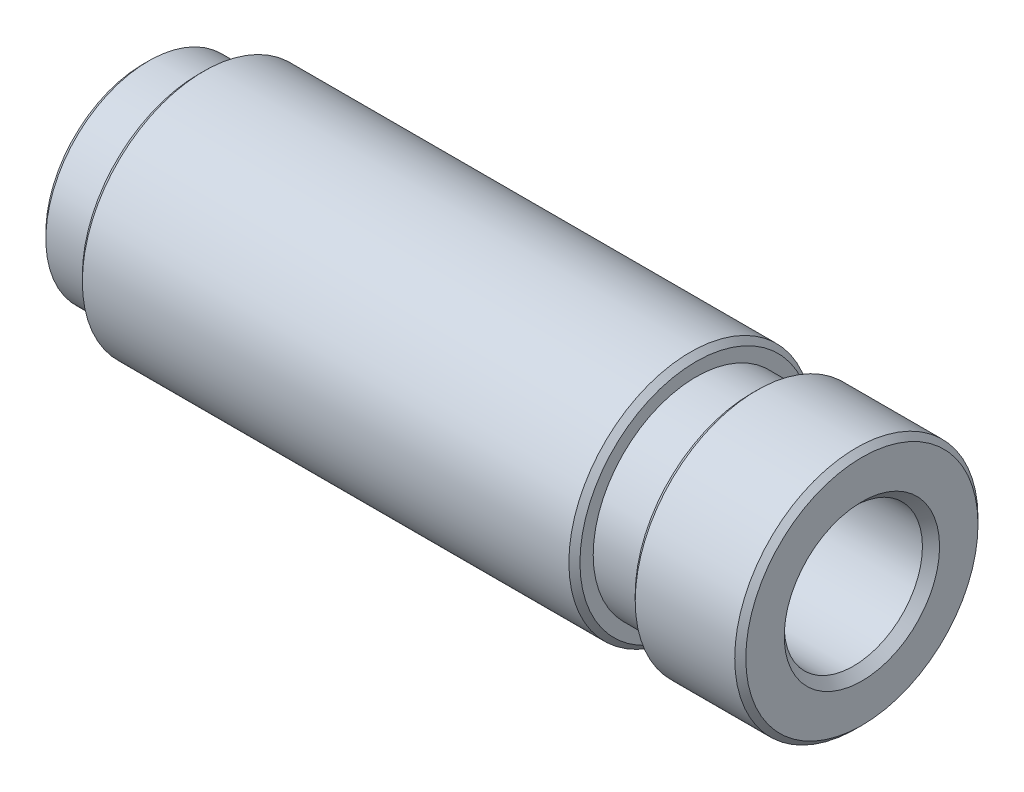
ISO-10303-21;
HEADER;
FILE_DESCRIPTION(('STEP AP214'),'2;1');
FILE_NAME('part.step','',(''),(''),'','','');
FILE_SCHEMA(('AUTOMOTIVE_DESIGN { 1 0 10303 214 1 1 1 1 }'));
ENDSEC;
DATA;
#1=APPLICATION_CONTEXT('core data for automotive mechanical design processes');
#2=APPLICATION_PROTOCOL_DEFINITION('international standard','automotive_design',2000,#1);
#3=PRODUCT_CONTEXT('',#1,'mechanical');
#4=PRODUCT('Part','Part','',(#3));
#5=PRODUCT_RELATED_PRODUCT_CATEGORY('part','',(#4));
#6=PRODUCT_DEFINITION_FORMATION('','',#4);
#7=PRODUCT_DEFINITION_CONTEXT('part definition',#1,'design');
#8=PRODUCT_DEFINITION('design','',#6,#7);
#9=PRODUCT_DEFINITION_SHAPE('','',#8);
#10=(LENGTH_UNIT() NAMED_UNIT(*) SI_UNIT(.MILLI.,.METRE.));
#11=(NAMED_UNIT(*) PLANE_ANGLE_UNIT() SI_UNIT($,.RADIAN.));
#12=(NAMED_UNIT(*) SI_UNIT($,.STERADIAN.) SOLID_ANGLE_UNIT());
#13=UNCERTAINTY_MEASURE_WITH_UNIT(LENGTH_MEASURE(1.E-05),#10,'distance_accuracy_value','');
#14=(GEOMETRIC_REPRESENTATION_CONTEXT(3) GLOBAL_UNCERTAINTY_ASSIGNED_CONTEXT((#13)) GLOBAL_UNIT_ASSIGNED_CONTEXT((#10,
#11,#12)) REPRESENTATION_CONTEXT('',''));
#15=CARTESIAN_POINT('',(0.,0.,0.));
#16=DIRECTION('',(0.,0.,1.));
#17=DIRECTION('',(1.,0.,0.));
#18=AXIS2_PLACEMENT_3D('',#15,#16,#17);
#19=CARTESIAN_POINT('',(0.,9.3,0.));
#20=DIRECTION('',(1.,0.,0.));
#21=DIRECTION('',(0.,0.,-1.));
#22=AXIS2_PLACEMENT_3D('',#19,#20,#21);
#23=PLANE('',#22);
#24=CARTESIAN_POINT('',(0.,0.,0.));
#25=DIRECTION('',(1.,0.,0.));
#26=DIRECTION('',(0.,0.,-1.));
#27=AXIS2_PLACEMENT_3D('',#24,#25,#26);
#28=CIRCLE('',#27,8.79999999999999);
#29=CARTESIAN_POINT('',(0.,0.,-8.79999999999999));
#30=VERTEX_POINT('',#29);
#31=EDGE_CURVE('E43',#30,#30,#28,.F.);
#32=ORIENTED_EDGE('',*,*,#31,.T.);
#33=EDGE_LOOP('',(#32));
#34=FACE_BOUND('',#33,.T.);
#35=CARTESIAN_POINT('',(0.,0.,0.));
#36=DIRECTION('',(1.,0.,0.));
#37=DIRECTION('',(0.,0.,-1.));
#38=AXIS2_PLACEMENT_3D('',#35,#36,#37);
#39=CIRCLE('',#38,6.52500000000001);
#40=CARTESIAN_POINT('',(0.,0.,-6.52500000000001));
#41=VERTEX_POINT('',#40);
#42=EDGE_CURVE('E62',#41,#41,#39,.T.);
#43=ORIENTED_EDGE('',*,*,#42,.T.);
#44=EDGE_LOOP('',(#43));
#45=FACE_BOUND('',#44,.T.);
#46=ADVANCED_FACE('F36',(#34,#45),#23,.F.);
#47=CARTESIAN_POINT('',(65.,0.,0.));
#48=DIRECTION('',(-1.,0.,0.));
#49=DIRECTION('',(0.,0.,1.));
#50=AXIS2_PLACEMENT_3D('',#47,#48,#49);
#51=PLANE('',#50);
#52=CARTESIAN_POINT('',(65.,0.,0.));
#53=DIRECTION('',(-1.,0.,0.));
#54=DIRECTION('',(0.,0.,1.));
#55=AXIS2_PLACEMENT_3D('',#52,#53,#54);
#56=CIRCLE('',#55,10.5);
#57=CARTESIAN_POINT('',(65.,0.,10.5));
#58=VERTEX_POINT('',#57);
#59=EDGE_CURVE('E51',#58,#58,#56,.F.);
#60=ORIENTED_EDGE('',*,*,#59,.T.);
#61=EDGE_LOOP('',(#60));
#62=FACE_BOUND('',#61,.T.);
#63=CARTESIAN_POINT('',(65.,0.,0.));
#64=DIRECTION('',(1.,0.,0.));
#65=DIRECTION('',(0.,0.,-1.));
#66=AXIS2_PLACEMENT_3D('',#63,#64,#65);
#67=CIRCLE('',#66,7.025);
#68=CARTESIAN_POINT('',(65.,0.,-7.025));
#69=VERTEX_POINT('',#68);
#70=EDGE_CURVE('E90',#69,#69,#67,.T.);
#71=ORIENTED_EDGE('',*,*,#70,.F.);
#72=EDGE_LOOP('',(#71));
#73=FACE_BOUND('',#72,.T.);
#74=ADVANCED_FACE('F107',(#62,#73),#51,.F.);
#75=CARTESIAN_POINT('',(0.,0.,0.));
#76=DIRECTION('',(-1.,0.,0.));
#77=DIRECTION('',(0.,0.,1.));
#78=AXIS2_PLACEMENT_3D('',#75,#76,#77);
#79=CYLINDRICAL_SURFACE('',#78,11.);
#80=CARTESIAN_POINT('',(64.5,0.,0.));
#81=DIRECTION('',(-1.,0.,0.));
#82=DIRECTION('',(0.,0.,1.));
#83=AXIS2_PLACEMENT_3D('',#80,#81,#82);
#84=CIRCLE('',#83,11.);
#85=CARTESIAN_POINT('',(64.5,0.,11.));
#86=VERTEX_POINT('',#85);
#87=EDGE_CURVE('E56',#86,#86,#84,.T.);
#88=ORIENTED_EDGE('',*,*,#87,.T.);
#89=EDGE_LOOP('',(#88));
#90=FACE_BOUND('',#89,.T.);
#91=CARTESIAN_POINT('',(55.5,0.,0.));
#92=DIRECTION('',(1.,0.,0.));
#93=DIRECTION('',(0.,0.,-1.));
#94=AXIS2_PLACEMENT_3D('',#91,#92,#93);
#95=CIRCLE('',#94,11.);
#96=CARTESIAN_POINT('',(55.5,0.,-11.));
#97=VERTEX_POINT('',#96);
#98=EDGE_CURVE('E59',#97,#97,#95,.T.);
#99=ORIENTED_EDGE('',*,*,#98,.T.);
#100=EDGE_LOOP('',(#99));
#101=FACE_BOUND('',#100,.T.);
#102=ADVANCED_FACE('F109',(#90,#101),#79,.T.);
#103=CARTESIAN_POINT('',(55.,11.,0.));
#104=DIRECTION('',(1.,0.,0.));
#105=DIRECTION('',(0.,0.,-1.));
#106=AXIS2_PLACEMENT_3D('',#103,#104,#105);
#107=PLANE('',#106);
#108=CARTESIAN_POINT('',(55.,0.,0.));
#109=DIRECTION('',(1.,0.,0.));
#110=DIRECTION('',(0.,0.,-1.));
#111=AXIS2_PLACEMENT_3D('',#108,#109,#110);
#112=CIRCLE('',#111,10.5);
#113=CARTESIAN_POINT('',(55.,0.,-10.5));
#114=VERTEX_POINT('',#113);
#115=EDGE_CURVE('E47',#114,#114,#112,.F.);
#116=ORIENTED_EDGE('',*,*,#115,.T.);
#117=EDGE_LOOP('',(#116));
#118=FACE_BOUND('',#117,.T.);
#119=CARTESIAN_POINT('',(55.,0.,0.));
#120=DIRECTION('',(-1.,0.,0.));
#121=DIRECTION('',(0.,0.,1.));
#122=AXIS2_PLACEMENT_3D('',#119,#120,#121);
#123=CIRCLE('',#122,9.3);
#124=CARTESIAN_POINT('',(55.,0.,9.3));
#125=VERTEX_POINT('',#124);
#126=EDGE_CURVE('E86',#125,#125,#123,.T.);
#127=ORIENTED_EDGE('',*,*,#126,.F.);
#128=EDGE_LOOP('',(#127));
#129=FACE_BOUND('',#128,.T.);
#130=ADVANCED_FACE('F116',(#118,#129),#107,.F.);
#131=CARTESIAN_POINT('',(0.,0.,0.));
#132=DIRECTION('',(-1.,0.,0.));
#133=DIRECTION('',(0.,0.,1.));
#134=AXIS2_PLACEMENT_3D('',#131,#132,#133);
#135=CYLINDRICAL_SURFACE('',#134,9.3);
#136=CARTESIAN_POINT('',(50.,0.,0.));
#137=DIRECTION('',(-1.,0.,0.));
#138=DIRECTION('',(0.,0.,1.));
#139=AXIS2_PLACEMENT_3D('',#136,#137,#138);
#140=CIRCLE('',#139,9.3);
#141=CARTESIAN_POINT('',(50.,0.,9.3));
#142=VERTEX_POINT('',#141);
#143=EDGE_CURVE('E93',#142,#142,#140,.T.);
#144=ORIENTED_EDGE('',*,*,#143,.F.);
#145=EDGE_LOOP('',(#144));
#146=FACE_BOUND('',#145,.T.);
#147=ORIENTED_EDGE('',*,*,#126,.T.);
#148=EDGE_LOOP('',(#147));
#149=FACE_BOUND('',#148,.T.);
#150=ADVANCED_FACE('F155',(#146,#149),#135,.T.);
#151=CARTESIAN_POINT('',(50.,9.3,0.));
#152=DIRECTION('',(-1.,0.,0.));
#153=DIRECTION('',(0.,0.,1.));
#154=AXIS2_PLACEMENT_3D('',#151,#152,#153);
#155=PLANE('',#154);
#156=CARTESIAN_POINT('',(50.,0.,0.));
#157=DIRECTION('',(-1.,0.,0.));
#158=DIRECTION('',(0.,0.,1.));
#159=AXIS2_PLACEMENT_3D('',#156,#157,#158);
#160=CIRCLE('',#159,10.5);
#161=CARTESIAN_POINT('',(50.,0.,10.5));
#162=VERTEX_POINT('',#161);
#163=EDGE_CURVE('E68',#162,#162,#160,.F.);
#164=ORIENTED_EDGE('',*,*,#163,.T.);
#165=EDGE_LOOP('',(#164));
#166=FACE_BOUND('',#165,.T.);
#167=ORIENTED_EDGE('',*,*,#143,.T.);
#168=EDGE_LOOP('',(#167));
#169=FACE_BOUND('',#168,.T.);
#170=ADVANCED_FACE('F159',(#166,#169),#155,.F.);
#171=CARTESIAN_POINT('',(0.,0.,0.));
#172=DIRECTION('',(-1.,0.,0.));
#173=DIRECTION('',(0.,0.,1.));
#174=AXIS2_PLACEMENT_3D('',#171,#172,#173);
#175=CYLINDRICAL_SURFACE('',#174,11.);
#176=CARTESIAN_POINT('',(5.50000000000001,0.,0.));
#177=DIRECTION('',(1.,0.,0.));
#178=DIRECTION('',(0.,0.,-1.));
#179=AXIS2_PLACEMENT_3D('',#176,#177,#178);
#180=CIRCLE('',#179,11.);
#181=CARTESIAN_POINT('',(5.50000000000001,0.,-11.));
#182=VERTEX_POINT('',#181);
#183=EDGE_CURVE('E74',#182,#182,#180,.T.);
#184=ORIENTED_EDGE('',*,*,#183,.T.);
#185=EDGE_LOOP('',(#184));
#186=FACE_BOUND('',#185,.T.);
#187=CARTESIAN_POINT('',(49.5,0.,0.));
#188=DIRECTION('',(-1.,0.,0.));
#189=DIRECTION('',(0.,0.,1.));
#190=AXIS2_PLACEMENT_3D('',#187,#188,#189);
#191=CIRCLE('',#190,11.);
#192=CARTESIAN_POINT('',(49.5,0.,11.));
#193=VERTEX_POINT('',#192);
#194=EDGE_CURVE('E77',#193,#193,#191,.T.);
#195=ORIENTED_EDGE('',*,*,#194,.T.);
#196=EDGE_LOOP('',(#195));
#197=FACE_BOUND('',#196,.T.);
#198=ADVANCED_FACE('F165',(#186,#197),#175,.T.);
#199=CARTESIAN_POINT('',(5.,11.,0.));
#200=DIRECTION('',(1.,0.,0.));
#201=DIRECTION('',(0.,0.,-1.));
#202=AXIS2_PLACEMENT_3D('',#199,#200,#201);
#203=PLANE('',#202);
#204=CARTESIAN_POINT('',(5.,0.,0.));
#205=DIRECTION('',(1.,0.,0.));
#206=DIRECTION('',(0.,0.,-1.));
#207=AXIS2_PLACEMENT_3D('',#204,#205,#206);
#208=CIRCLE('',#207,10.5);
#209=CARTESIAN_POINT('',(5.,0.,-10.5));
#210=VERTEX_POINT('',#209);
#211=EDGE_CURVE('E80',#210,#210,#208,.F.);
#212=ORIENTED_EDGE('',*,*,#211,.T.);
#213=EDGE_LOOP('',(#212));
#214=FACE_BOUND('',#213,.T.);
#215=CARTESIAN_POINT('',(5.,0.,0.));
#216=DIRECTION('',(1.,0.,0.));
#217=DIRECTION('',(0.,0.,-1.));
#218=AXIS2_PLACEMENT_3D('',#215,#216,#217);
#219=CIRCLE('',#218,9.79999999999998);
#220=CARTESIAN_POINT('',(5.,0.,-9.79999999999998));
#221=VERTEX_POINT('',#220);
#222=EDGE_CURVE('E83',#221,#221,#219,.T.);
#223=ORIENTED_EDGE('',*,*,#222,.T.);
#224=EDGE_LOOP('',(#223));
#225=FACE_BOUND('',#224,.T.);
#226=ADVANCED_FACE('F172',(#214,#225),#203,.F.);
#227=CARTESIAN_POINT('',(0.,0.,0.));
#228=DIRECTION('',(-1.,0.,0.));
#229=DIRECTION('',(0.,0.,1.));
#230=AXIS2_PLACEMENT_3D('',#227,#228,#229);
#231=CYLINDRICAL_SURFACE('',#230,9.3);
#232=CARTESIAN_POINT('',(0.500000000000016,0.,0.));
#233=DIRECTION('',(1.,0.,0.));
#234=DIRECTION('',(0.,0.,-1.));
#235=AXIS2_PLACEMENT_3D('',#232,#233,#234);
#236=CIRCLE('',#235,9.3);
#237=CARTESIAN_POINT('',(0.500000000000016,0.,-9.3));
#238=VERTEX_POINT('',#237);
#239=EDGE_CURVE('E10',#238,#238,#236,.T.);
#240=ORIENTED_EDGE('',*,*,#239,.T.);
#241=EDGE_LOOP('',(#240));
#242=FACE_BOUND('',#241,.T.);
#243=CARTESIAN_POINT('',(4.50000000000001,0.,0.));
#244=DIRECTION('',(1.,0.,0.));
#245=DIRECTION('',(0.,0.,-1.));
#246=AXIS2_PLACEMENT_3D('',#243,#244,#245);
#247=CIRCLE('',#246,9.3);
#248=CARTESIAN_POINT('',(4.50000000000001,0.,-9.3));
#249=VERTEX_POINT('',#248);
#250=EDGE_CURVE('E71',#249,#249,#247,.F.);
#251=ORIENTED_EDGE('',*,*,#250,.T.);
#252=EDGE_LOOP('',(#251));
#253=FACE_BOUND('',#252,.T.);
#254=ADVANCED_FACE('F176',(#242,#253),#231,.T.);
#255=CARTESIAN_POINT('',(33.,0.,0.));
#256=DIRECTION('',(1.,0.,0.));
#257=DIRECTION('',(0.,0.,-1.));
#258=AXIS2_PLACEMENT_3D('',#255,#256,#257);
#259=CONICAL_SURFACE('',#258,6.24999999999999,1.02974425867665);
#260=CARTESIAN_POINT('',(32.4442039273995,0.,0.));
#261=DIRECTION('',(1.,0.,0.));
#262=DIRECTION('',(0.,0.,-1.));
#263=AXIS2_PLACEMENT_3D('',#260,#261,#262);
#264=CIRCLE('',#263,5.32500000000001);
#265=CARTESIAN_POINT('',(32.4442039273995,0.,-5.32500000000001));
#266=VERTEX_POINT('',#265);
#267=EDGE_CURVE('E87',#266,#266,#264,.F.);
#268=ORIENTED_EDGE('',*,*,#267,.T.);
#269=EDGE_LOOP('',(#268));
#270=FACE_BOUND('',#269,.T.);
#271=CARTESIAN_POINT('',(33.,0.,0.));
#272=DIRECTION('',(1.,0.,0.));
#273=DIRECTION('',(0.,0.,-1.));
#274=AXIS2_PLACEMENT_3D('',#271,#272,#273);
#275=CIRCLE('',#274,6.24999999999999);
#276=CARTESIAN_POINT('',(33.,0.,-6.24999999999999));
#277=VERTEX_POINT('',#276);
#278=EDGE_CURVE('E96',#277,#277,#275,.T.);
#279=ORIENTED_EDGE('',*,*,#278,.T.);
#280=EDGE_LOOP('',(#279));
#281=FACE_BOUND('',#280,.T.);
#282=ADVANCED_FACE('F180',(#270,#281),#259,.F.);
#283=CARTESIAN_POINT('',(65.,0.,0.));
#284=DIRECTION('',(1.,0.,0.));
#285=DIRECTION('',(0.,0.,-1.));
#286=AXIS2_PLACEMENT_3D('',#283,#284,#285);
#287=CYLINDRICAL_SURFACE('',#286,6.24999999999999);
#288=ORIENTED_EDGE('',*,*,#278,.F.);
#289=EDGE_LOOP('',(#288));
#290=FACE_BOUND('',#289,.T.);
#291=CARTESIAN_POINT('',(64.225,0.,0.));
#292=DIRECTION('',(1.,0.,0.));
#293=DIRECTION('',(0.,0.,-1.));
#294=AXIS2_PLACEMENT_3D('',#291,#292,#293);
#295=CIRCLE('',#294,6.25);
#296=CARTESIAN_POINT('',(64.225,0.,-6.25));
#297=VERTEX_POINT('',#296);
#298=EDGE_CURVE('E99',#297,#297,#295,.T.);
#299=ORIENTED_EDGE('',*,*,#298,.T.);
#300=EDGE_LOOP('',(#299));
#301=FACE_BOUND('',#300,.T.);
#302=ADVANCED_FACE('F183',(#290,#301),#287,.F.);
#303=CARTESIAN_POINT('',(65.,0.,0.));
#304=DIRECTION('',(1.,0.,0.));
#305=DIRECTION('',(0.,0.,-1.));
#306=AXIS2_PLACEMENT_3D('',#303,#304,#305);
#307=CONICAL_SURFACE('',#306,7.025,0.785398163397444);
#308=ORIENTED_EDGE('',*,*,#298,.F.);
#309=EDGE_LOOP('',(#308));
#310=FACE_BOUND('',#309,.T.);
#311=ORIENTED_EDGE('',*,*,#70,.T.);
#312=EDGE_LOOP('',(#311));
#313=FACE_BOUND('',#312,.T.);
#314=ADVANCED_FACE('F105',(#310,#313),#307,.F.);
#315=CARTESIAN_POINT('',(0.,0.,0.));
#316=DIRECTION('',(-1.,0.,0.));
#317=DIRECTION('',(0.,0.,1.));
#318=AXIS2_PLACEMENT_3D('',#315,#316,#317);
#319=CYLINDRICAL_SURFACE('',#318,5.32500000000001);
#320=CARTESIAN_POINT('',(1.2,0.,0.));
#321=DIRECTION('',(1.,0.,0.));
#322=DIRECTION('',(0.,0.,-1.));
#323=AXIS2_PLACEMENT_3D('',#320,#321,#322);
#324=CIRCLE('',#323,5.32500000000001);
#325=CARTESIAN_POINT('',(1.2,0.,-5.32500000000001));
#326=VERTEX_POINT('',#325);
#327=EDGE_CURVE('E65',#326,#326,#324,.F.);
#328=ORIENTED_EDGE('',*,*,#327,.T.);
#329=EDGE_LOOP('',(#328));
#330=FACE_BOUND('',#329,.T.);
#331=ORIENTED_EDGE('',*,*,#267,.F.);
#332=EDGE_LOOP('',(#331));
#333=FACE_BOUND('',#332,.T.);
#334=ADVANCED_FACE('F126',(#330,#333),#319,.F.);
#335=CARTESIAN_POINT('',(5.,0.,0.));
#336=DIRECTION('',(1.,0.,0.));
#337=DIRECTION('',(0.,0.,-1.));
#338=AXIS2_PLACEMENT_3D('',#335,#336,#337);
#339=CONICAL_SURFACE('',#338,10.5,0.785398163397445);
#340=ORIENTED_EDGE('',*,*,#183,.F.);
#341=EDGE_LOOP('',(#340));
#342=FACE_BOUND('',#341,.T.);
#343=ORIENTED_EDGE('',*,*,#211,.F.);
#344=EDGE_LOOP('',(#343));
#345=FACE_BOUND('',#344,.T.);
#346=ADVANCED_FACE('F122',(#342,#345),#339,.T.);
#347=CARTESIAN_POINT('',(4.50000000000001,0.,0.));
#348=DIRECTION('',(1.,0.,0.));
#349=DIRECTION('',(0.,0.,-1.));
#350=AXIS2_PLACEMENT_3D('',#347,#348,#349);
#351=CONICAL_SURFACE('',#350,9.3,0.78539816339744);
#352=ORIENTED_EDGE('',*,*,#222,.F.);
#353=EDGE_LOOP('',(#352));
#354=FACE_BOUND('',#353,.T.);
#355=ORIENTED_EDGE('',*,*,#250,.F.);
#356=EDGE_LOOP('',(#355));
#357=FACE_BOUND('',#356,.T.);
#358=ADVANCED_FACE('F125',(#354,#357),#351,.T.);
#359=CARTESIAN_POINT('',(49.5,0.,0.));
#360=DIRECTION('',(-1.,0.,0.));
#361=DIRECTION('',(0.,0.,1.));
#362=AXIS2_PLACEMENT_3D('',#359,#360,#361);
#363=CONICAL_SURFACE('',#362,11.,0.785398163397445);
#364=ORIENTED_EDGE('',*,*,#163,.F.);
#365=EDGE_LOOP('',(#364));
#366=FACE_BOUND('',#365,.T.);
#367=ORIENTED_EDGE('',*,*,#194,.F.);
#368=EDGE_LOOP('',(#367));
#369=FACE_BOUND('',#368,.T.);
#370=ADVANCED_FACE('F130',(#366,#369),#363,.T.);
#371=CARTESIAN_POINT('',(1.2,0.,0.));
#372=DIRECTION('',(1.,0.,0.));
#373=DIRECTION('',(0.,0.,-1.));
#374=AXIS2_PLACEMENT_3D('',#371,#372,#373);
#375=TOROIDAL_SURFACE('',#374,6.52500000000001,1.2);
#376=ORIENTED_EDGE('',*,*,#42,.F.);
#377=EDGE_LOOP('',(#376));
#378=FACE_BOUND('',#377,.T.);
#379=ORIENTED_EDGE('',*,*,#327,.F.);
#380=EDGE_LOOP('',(#379));
#381=FACE_BOUND('',#380,.T.);
#382=ADVANCED_FACE('F134',(#378,#381),#375,.T.);
#383=CARTESIAN_POINT('',(64.5,0.,0.));
#384=DIRECTION('',(-1.,0.,0.));
#385=DIRECTION('',(0.,0.,1.));
#386=AXIS2_PLACEMENT_3D('',#383,#384,#385);
#387=CONICAL_SURFACE('',#386,11.,0.78539816339744);
#388=ORIENTED_EDGE('',*,*,#59,.F.);
#389=EDGE_LOOP('',(#388));
#390=FACE_BOUND('',#389,.T.);
#391=ORIENTED_EDGE('',*,*,#87,.F.);
#392=EDGE_LOOP('',(#391));
#393=FACE_BOUND('',#392,.T.);
#394=ADVANCED_FACE('F138',(#390,#393),#387,.T.);
#395=CARTESIAN_POINT('',(55.,0.,0.));
#396=DIRECTION('',(1.,0.,0.));
#397=DIRECTION('',(0.,0.,-1.));
#398=AXIS2_PLACEMENT_3D('',#395,#396,#397);
#399=CONICAL_SURFACE('',#398,10.5,0.785398163397447);
#400=ORIENTED_EDGE('',*,*,#98,.F.);
#401=EDGE_LOOP('',(#400));
#402=FACE_BOUND('',#401,.T.);
#403=ORIENTED_EDGE('',*,*,#115,.F.);
#404=EDGE_LOOP('',(#403));
#405=FACE_BOUND('',#404,.T.);
#406=ADVANCED_FACE('F141',(#402,#405),#399,.T.);
#407=CARTESIAN_POINT('',(0.,0.,0.));
#408=DIRECTION('',(1.,0.,0.));
#409=DIRECTION('',(0.,0.,-1.));
#410=AXIS2_PLACEMENT_3D('',#407,#408,#409);
#411=CONICAL_SURFACE('',#410,8.79999999999999,0.785398163397445);
#412=ORIENTED_EDGE('',*,*,#239,.F.);
#413=EDGE_LOOP('',(#412));
#414=FACE_BOUND('',#413,.T.);
#415=ORIENTED_EDGE('',*,*,#31,.F.);
#416=EDGE_LOOP('',(#415));
#417=FACE_BOUND('',#416,.T.);
#418=ADVANCED_FACE('F38',(#414,#417),#411,.T.);
#419=CLOSED_SHELL('',(#46,#74,#102,#130,#150,#170,#198,#226,#254,#282,#302,#314,#334,#346,#358,
#370,#382,#394,#406,#418));
#420=MANIFOLD_SOLID_BREP('B2',#419);
#421=ADVANCED_BREP_SHAPE_REPRESENTATION('',(#18,#420),#14);
#422=SHAPE_DEFINITION_REPRESENTATION(#9,#421);
ENDSEC;
END-ISO-10303-21;
